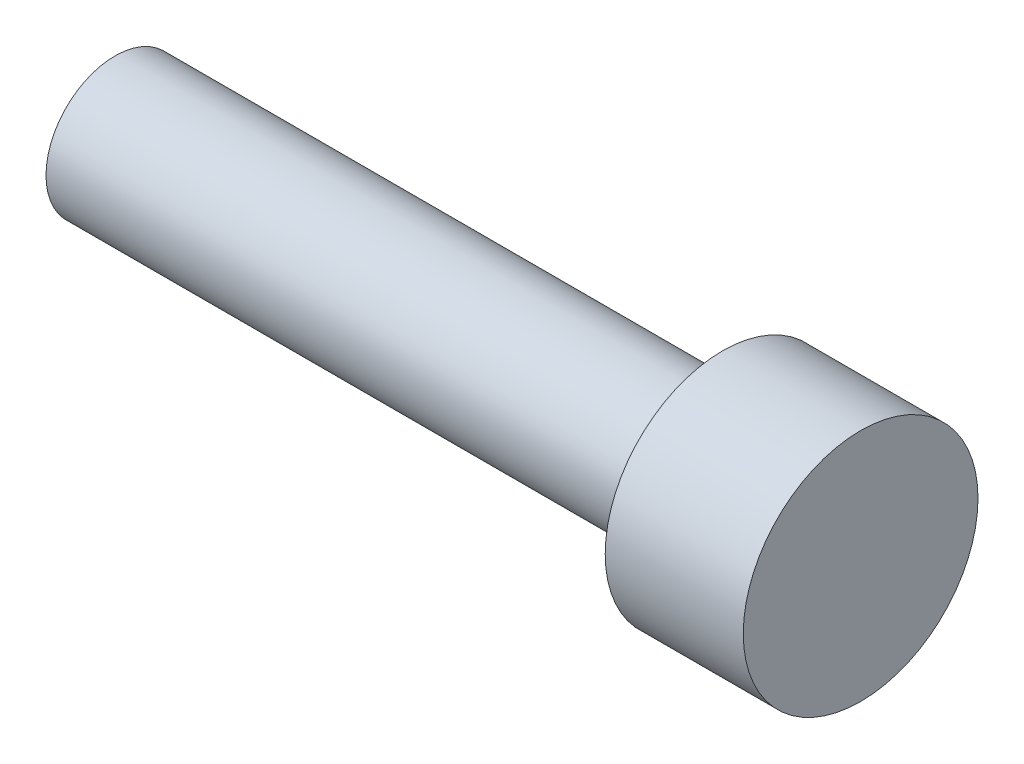
ISO-10303-21;
HEADER;
FILE_DESCRIPTION(('STEP AP214'),'2;1');
FILE_NAME('part.step','',(''),(''),'','','');
FILE_SCHEMA(('AUTOMOTIVE_DESIGN { 1 0 10303 214 1 1 1 1 }'));
ENDSEC;
DATA;
#1=APPLICATION_CONTEXT('core data for automotive mechanical design processes');
#2=APPLICATION_PROTOCOL_DEFINITION('international standard','automotive_design',2000,#1);
#3=PRODUCT_CONTEXT('',#1,'mechanical');
#4=PRODUCT('Part','Part','',(#3));
#5=PRODUCT_RELATED_PRODUCT_CATEGORY('part','',(#4));
#6=PRODUCT_DEFINITION_FORMATION('','',#4);
#7=PRODUCT_DEFINITION_CONTEXT('part definition',#1,'design');
#8=PRODUCT_DEFINITION('design','',#6,#7);
#9=PRODUCT_DEFINITION_SHAPE('','',#8);
#10=(LENGTH_UNIT() NAMED_UNIT(*) SI_UNIT(.MILLI.,.METRE.));
#11=(NAMED_UNIT(*) PLANE_ANGLE_UNIT() SI_UNIT($,.RADIAN.));
#12=(NAMED_UNIT(*) SI_UNIT($,.STERADIAN.) SOLID_ANGLE_UNIT());
#13=UNCERTAINTY_MEASURE_WITH_UNIT(LENGTH_MEASURE(1.E-05),#10,'distance_accuracy_value','');
#14=(GEOMETRIC_REPRESENTATION_CONTEXT(3) GLOBAL_UNCERTAINTY_ASSIGNED_CONTEXT((#13)) GLOBAL_UNIT_ASSIGNED_CONTEXT((#10,
#11,#12)) REPRESENTATION_CONTEXT('',''));
#15=CARTESIAN_POINT('',(0.,0.,0.));
#16=DIRECTION('',(0.,0.,1.));
#17=DIRECTION('',(1.,0.,0.));
#18=AXIS2_PLACEMENT_3D('',#15,#16,#17);
#19=CARTESIAN_POINT('',(-22.,0.,0.));
#20=DIRECTION('',(1.,0.,0.));
#21=DIRECTION('',(0.,1.,0.));
#22=AXIS2_PLACEMENT_3D('',#19,#20,#21);
#23=PLANE('',#22);
#24=CARTESIAN_POINT('',(-22.,0.,0.));
#25=DIRECTION('',(1.,0.,0.));
#26=DIRECTION('',(0.,0.,1.));
#27=AXIS2_PLACEMENT_3D('',#24,#25,#26);
#28=CIRCLE('',#27,2.5);
#29=CARTESIAN_POINT('',(-22.,0.,2.5));
#30=VERTEX_POINT('',#29);
#31=EDGE_CURVE('E10',#30,#30,#28,.T.);
#32=ORIENTED_EDGE('',*,*,#31,.F.);
#33=EDGE_LOOP('',(#32));
#34=FACE_BOUND('',#33,.T.);
#35=ADVANCED_FACE('F16',(#34),#23,.F.);
#36=CARTESIAN_POINT('',(-22.,0.,0.));
#37=DIRECTION('',(1.,0.,0.));
#38=DIRECTION('',(0.,0.,1.));
#39=AXIS2_PLACEMENT_3D('',#36,#37,#38);
#40=CYLINDRICAL_SURFACE('',#39,2.5);
#41=CARTESIAN_POINT('',(0.,0.,0.));
#42=DIRECTION('',(1.,0.,0.));
#43=DIRECTION('',(0.,0.,1.));
#44=AXIS2_PLACEMENT_3D('',#41,#42,#43);
#45=CIRCLE('',#44,2.5);
#46=CARTESIAN_POINT('',(0.,0.,2.5));
#47=VERTEX_POINT('',#46);
#48=EDGE_CURVE('E19',#47,#47,#45,.T.);
#49=ORIENTED_EDGE('',*,*,#48,.F.);
#50=DIRECTION('',(1.,0.,0.));
#51=VECTOR('',#50,1.);
#52=CARTESIAN_POINT('',(-22.,0.,2.5));
#53=LINE('',#52,#51);
#54=EDGE_CURVE('E26',#30,#47,#53,.T.);
#55=ORIENTED_EDGE('',*,*,#54,.F.);
#56=ORIENTED_EDGE('',*,*,#31,.T.);
#57=ORIENTED_EDGE('',*,*,#54,.T.);
#58=EDGE_LOOP('',(#49,#55,#56,#57));
#59=FACE_BOUND('',#58,.T.);
#60=ADVANCED_FACE('F74',(#59),#40,.T.);
#61=CARTESIAN_POINT('',(0.,0.,0.));
#62=DIRECTION('',(1.,0.,0.));
#63=DIRECTION('',(0.,1.,0.));
#64=AXIS2_PLACEMENT_3D('',#61,#62,#63);
#65=PLANE('',#64);
#66=ORIENTED_EDGE('',*,*,#48,.T.);
#67=EDGE_LOOP('',(#66));
#68=FACE_BOUND('',#67,.T.);
#69=CARTESIAN_POINT('',(0.,0.,0.));
#70=DIRECTION('',(1.,0.,0.));
#71=DIRECTION('',(0.,0.,1.));
#72=AXIS2_PLACEMENT_3D('',#69,#70,#71);
#73=CIRCLE('',#72,4.25);
#74=CARTESIAN_POINT('',(0.,0.,4.25));
#75=VERTEX_POINT('',#74);
#76=EDGE_CURVE('E54',#75,#75,#73,.T.);
#77=ORIENTED_EDGE('',*,*,#76,.F.);
#78=EDGE_LOOP('',(#77));
#79=FACE_BOUND('',#78,.T.);
#80=ADVANCED_FACE('F72',(#68,#79),#65,.F.);
#81=CARTESIAN_POINT('',(5.,0.,0.));
#82=DIRECTION('',(1.,0.,0.));
#83=DIRECTION('',(0.,1.,0.));
#84=AXIS2_PLACEMENT_3D('',#81,#82,#83);
#85=PLANE('',#84);
#86=CARTESIAN_POINT('',(5.,0.,0.));
#87=DIRECTION('',(1.,0.,0.));
#88=DIRECTION('',(0.,0.,1.));
#89=AXIS2_PLACEMENT_3D('',#86,#87,#88);
#90=CIRCLE('',#89,4.25);
#91=CARTESIAN_POINT('',(5.,0.,4.25));
#92=VERTEX_POINT('',#91);
#93=EDGE_CURVE('E52',#92,#92,#90,.T.);
#94=ORIENTED_EDGE('',*,*,#93,.T.);
#95=EDGE_LOOP('',(#94));
#96=FACE_BOUND('',#95,.T.);
#97=ADVANCED_FACE('F58',(#96),#85,.T.);
#98=CARTESIAN_POINT('',(0.,0.,0.));
#99=DIRECTION('',(1.,0.,0.));
#100=DIRECTION('',(0.,0.,1.));
#101=AXIS2_PLACEMENT_3D('',#98,#99,#100);
#102=CYLINDRICAL_SURFACE('',#101,4.25);
#103=ORIENTED_EDGE('',*,*,#93,.F.);
#104=DIRECTION('',(1.,0.,0.));
#105=VECTOR('',#104,1.);
#106=CARTESIAN_POINT('',(0.,0.,4.25));
#107=LINE('',#106,#105);
#108=EDGE_CURVE('E49',#75,#92,#107,.T.);
#109=ORIENTED_EDGE('',*,*,#108,.F.);
#110=ORIENTED_EDGE('',*,*,#76,.T.);
#111=ORIENTED_EDGE('',*,*,#108,.T.);
#112=EDGE_LOOP('',(#103,#109,#110,#111));
#113=FACE_BOUND('',#112,.T.);
#114=ADVANCED_FACE('F51',(#113),#102,.T.);
#115=CLOSED_SHELL('',(#35,#60,#80,#97,#114));
#116=MANIFOLD_SOLID_BREP('B1',#115);
#117=ADVANCED_BREP_SHAPE_REPRESENTATION('',(#18,#116),#14);
#118=SHAPE_DEFINITION_REPRESENTATION(#9,#117);
ENDSEC;
END-ISO-10303-21;
